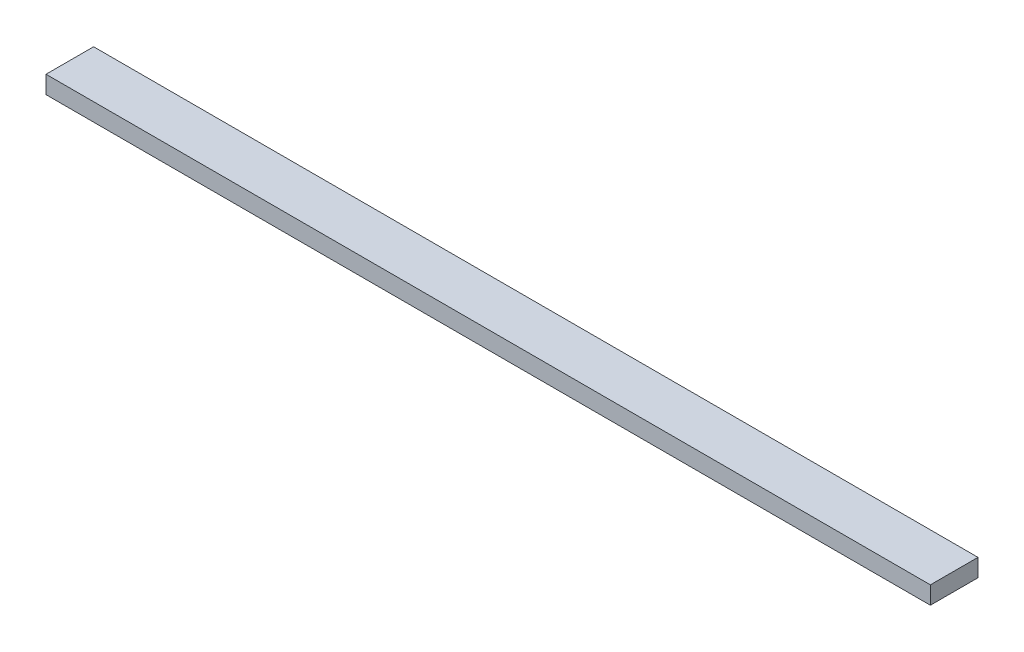
ISO-10303-21;
HEADER;
FILE_DESCRIPTION(('STEP AP214'),'2;1');
FILE_NAME('part.step','',(''),(''),'','','');
FILE_SCHEMA(('AUTOMOTIVE_DESIGN { 1 0 10303 214 1 1 1 1 }'));
ENDSEC;
DATA;
#1=APPLICATION_CONTEXT('core data for automotive mechanical design processes');
#2=APPLICATION_PROTOCOL_DEFINITION('international standard','automotive_design',2000,#1);
#3=PRODUCT_CONTEXT('',#1,'mechanical');
#4=PRODUCT('Part','Part','',(#3));
#5=PRODUCT_RELATED_PRODUCT_CATEGORY('part','',(#4));
#6=PRODUCT_DEFINITION_FORMATION('','',#4);
#7=PRODUCT_DEFINITION_CONTEXT('part definition',#1,'design');
#8=PRODUCT_DEFINITION('design','',#6,#7);
#9=PRODUCT_DEFINITION_SHAPE('','',#8);
#10=(LENGTH_UNIT() NAMED_UNIT(*) SI_UNIT(.MILLI.,.METRE.));
#11=(NAMED_UNIT(*) PLANE_ANGLE_UNIT() SI_UNIT($,.RADIAN.));
#12=(NAMED_UNIT(*) SI_UNIT($,.STERADIAN.) SOLID_ANGLE_UNIT());
#13=UNCERTAINTY_MEASURE_WITH_UNIT(LENGTH_MEASURE(1.E-05),#10,'distance_accuracy_value','');
#14=(GEOMETRIC_REPRESENTATION_CONTEXT(3) GLOBAL_UNCERTAINTY_ASSIGNED_CONTEXT((#13)) GLOBAL_UNIT_ASSIGNED_CONTEXT((#10,
#11,#12)) REPRESENTATION_CONTEXT('',''));
#15=CARTESIAN_POINT('',(0.,0.,0.));
#16=DIRECTION('',(0.,0.,1.));
#17=DIRECTION('',(1.,0.,0.));
#18=AXIS2_PLACEMENT_3D('',#15,#16,#17);
#19=CARTESIAN_POINT('',(125.,5.,-6.73099999999999));
#20=DIRECTION('',(-1.,0.,0.));
#21=DIRECTION('',(0.,0.,1.));
#22=AXIS2_PLACEMENT_3D('',#19,#20,#21);
#23=PLANE('',#22);
#24=DIRECTION('',(0.,0.,-1.));
#25=VECTOR('',#24,1.);
#26=CARTESIAN_POINT('',(125.,0.,-6.73099999999999));
#27=LINE('',#26,#25);
#28=CARTESIAN_POINT('',(125.,0.,6.73100000000001));
#29=VERTEX_POINT('',#28);
#30=CARTESIAN_POINT('',(125.,0.,-6.73099999999999));
#31=VERTEX_POINT('',#30);
#32=EDGE_CURVE('E104',#29,#31,#27,.T.);
#33=ORIENTED_EDGE('',*,*,#32,.T.);
#34=DIRECTION('',(0.,-1.,0.));
#35=VECTOR('',#34,1.);
#36=CARTESIAN_POINT('',(125.,5.,-6.73099999999999));
#37=LINE('',#36,#35);
#38=CARTESIAN_POINT('',(125.,5.,-6.73099999999999));
#39=VERTEX_POINT('',#38);
#40=EDGE_CURVE('E11',#39,#31,#37,.T.);
#41=ORIENTED_EDGE('',*,*,#40,.F.);
#42=DIRECTION('',(0.,0.,-1.));
#43=VECTOR('',#42,1.);
#44=CARTESIAN_POINT('',(125.,5.,-6.73099999999999));
#45=LINE('',#44,#43);
#46=CARTESIAN_POINT('',(125.,5.,6.73100000000001));
#47=VERTEX_POINT('',#46);
#48=EDGE_CURVE('E92',#47,#39,#45,.T.);
#49=ORIENTED_EDGE('',*,*,#48,.F.);
#50=DIRECTION('',(0.,-1.,0.));
#51=VECTOR('',#50,1.);
#52=CARTESIAN_POINT('',(125.,5.,6.73100000000001));
#53=LINE('',#52,#51);
#54=EDGE_CURVE('E100',#47,#29,#53,.T.);
#55=ORIENTED_EDGE('',*,*,#54,.T.);
#56=EDGE_LOOP('',(#33,#41,#49,#55));
#57=FACE_BOUND('',#56,.T.);
#58=ADVANCED_FACE('F41',(#57),#23,.F.);
#59=CARTESIAN_POINT('',(-125.,5.,-6.73099999999999));
#60=DIRECTION('',(0.,0.,1.));
#61=DIRECTION('',(1.,0.,0.));
#62=AXIS2_PLACEMENT_3D('',#59,#60,#61);
#63=PLANE('',#62);
#64=DIRECTION('',(-1.,0.,0.));
#65=VECTOR('',#64,1.);
#66=CARTESIAN_POINT('',(-125.,0.,-6.73099999999999));
#67=LINE('',#66,#65);
#68=CARTESIAN_POINT('',(-125.,0.,-6.73099999999999));
#69=VERTEX_POINT('',#68);
#70=EDGE_CURVE('E96',#31,#69,#67,.T.);
#71=ORIENTED_EDGE('',*,*,#70,.T.);
#72=DIRECTION('',(0.,-1.,0.));
#73=VECTOR('',#72,1.);
#74=CARTESIAN_POINT('',(-125.,5.,-6.73099999999999));
#75=LINE('',#74,#73);
#76=CARTESIAN_POINT('',(-125.,5.,-6.73099999999999));
#77=VERTEX_POINT('',#76);
#78=EDGE_CURVE('E49',#77,#69,#75,.T.);
#79=ORIENTED_EDGE('',*,*,#78,.F.);
#80=DIRECTION('',(-1.,0.,0.));
#81=VECTOR('',#80,1.);
#82=CARTESIAN_POINT('',(-125.,5.,-6.73099999999999));
#83=LINE('',#82,#81);
#84=EDGE_CURVE('E87',#39,#77,#83,.T.);
#85=ORIENTED_EDGE('',*,*,#84,.F.);
#86=ORIENTED_EDGE('',*,*,#40,.T.);
#87=EDGE_LOOP('',(#71,#79,#85,#86));
#88=FACE_BOUND('',#87,.T.);
#89=ADVANCED_FACE('F95',(#88),#63,.F.);
#90=CARTESIAN_POINT('',(-125.,5.,-6.73099999999999));
#91=DIRECTION('',(1.,0.,0.));
#92=DIRECTION('',(0.,0.,-1.));
#93=AXIS2_PLACEMENT_3D('',#90,#91,#92);
#94=PLANE('',#93);
#95=DIRECTION('',(0.,0.,1.));
#96=VECTOR('',#95,1.);
#97=CARTESIAN_POINT('',(-125.,0.,-6.73099999999999));
#98=LINE('',#97,#96);
#99=CARTESIAN_POINT('',(-125.,0.,6.73100000000001));
#100=VERTEX_POINT('',#99);
#101=EDGE_CURVE('E74',#69,#100,#98,.T.);
#102=ORIENTED_EDGE('',*,*,#101,.T.);
#103=DIRECTION('',(0.,-1.,0.));
#104=VECTOR('',#103,1.);
#105=CARTESIAN_POINT('',(-125.,5.,6.73100000000001));
#106=LINE('',#105,#104);
#107=CARTESIAN_POINT('',(-125.,5.,6.73100000000001));
#108=VERTEX_POINT('',#107);
#109=EDGE_CURVE('E97',#108,#100,#106,.T.);
#110=ORIENTED_EDGE('',*,*,#109,.F.);
#111=DIRECTION('',(0.,0.,1.));
#112=VECTOR('',#111,1.);
#113=CARTESIAN_POINT('',(-125.,5.,-6.73099999999999));
#114=LINE('',#113,#112);
#115=EDGE_CURVE('E90',#77,#108,#114,.T.);
#116=ORIENTED_EDGE('',*,*,#115,.F.);
#117=ORIENTED_EDGE('',*,*,#78,.T.);
#118=EDGE_LOOP('',(#102,#110,#116,#117));
#119=FACE_BOUND('',#118,.T.);
#120=ADVANCED_FACE('F98',(#119),#94,.F.);
#121=CARTESIAN_POINT('',(-125.,5.,6.73100000000001));
#122=DIRECTION('',(0.,0.,-1.));
#123=DIRECTION('',(-1.,0.,0.));
#124=AXIS2_PLACEMENT_3D('',#121,#122,#123);
#125=PLANE('',#124);
#126=DIRECTION('',(1.,0.,0.));
#127=VECTOR('',#126,1.);
#128=CARTESIAN_POINT('',(-125.,0.,6.73100000000001));
#129=LINE('',#128,#127);
#130=EDGE_CURVE('E80',#100,#29,#129,.T.);
#131=ORIENTED_EDGE('',*,*,#130,.T.);
#132=ORIENTED_EDGE('',*,*,#54,.F.);
#133=DIRECTION('',(1.,0.,0.));
#134=VECTOR('',#133,1.);
#135=CARTESIAN_POINT('',(-125.,5.,6.73100000000001));
#136=LINE('',#135,#134);
#137=EDGE_CURVE('E57',#108,#47,#136,.T.);
#138=ORIENTED_EDGE('',*,*,#137,.F.);
#139=ORIENTED_EDGE('',*,*,#109,.T.);
#140=EDGE_LOOP('',(#131,#132,#138,#139));
#141=FACE_BOUND('',#140,.T.);
#142=ADVANCED_FACE('F111',(#141),#125,.F.);
#143=CARTESIAN_POINT('',(0.,5.,0.));
#144=DIRECTION('',(0.,1.,0.));
#145=DIRECTION('',(0.,0.,1.));
#146=AXIS2_PLACEMENT_3D('',#143,#144,#145);
#147=PLANE('',#146);
#148=ORIENTED_EDGE('',*,*,#48,.T.);
#149=ORIENTED_EDGE('',*,*,#84,.T.);
#150=ORIENTED_EDGE('',*,*,#115,.T.);
#151=ORIENTED_EDGE('',*,*,#137,.T.);
#152=EDGE_LOOP('',(#148,#149,#150,#151));
#153=FACE_BOUND('',#152,.T.);
#154=ADVANCED_FACE('F88',(#153),#147,.T.);
#155=CARTESIAN_POINT('',(0.,0.,0.));
#156=DIRECTION('',(0.,1.,0.));
#157=DIRECTION('',(0.,0.,1.));
#158=AXIS2_PLACEMENT_3D('',#155,#156,#157);
#159=PLANE('',#158);
#160=ORIENTED_EDGE('',*,*,#32,.F.);
#161=ORIENTED_EDGE('',*,*,#130,.F.);
#162=ORIENTED_EDGE('',*,*,#101,.F.);
#163=ORIENTED_EDGE('',*,*,#70,.F.);
#164=EDGE_LOOP('',(#160,#161,#162,#163));
#165=FACE_BOUND('',#164,.T.);
#166=ADVANCED_FACE('F114',(#165),#159,.F.);
#167=CLOSED_SHELL('',(#58,#89,#120,#142,#154,#166));
#168=MANIFOLD_SOLID_BREP('B2',#167);
#169=ADVANCED_BREP_SHAPE_REPRESENTATION('',(#18,#168),#14);
#170=SHAPE_DEFINITION_REPRESENTATION(#9,#169);
ENDSEC;
END-ISO-10303-21;
